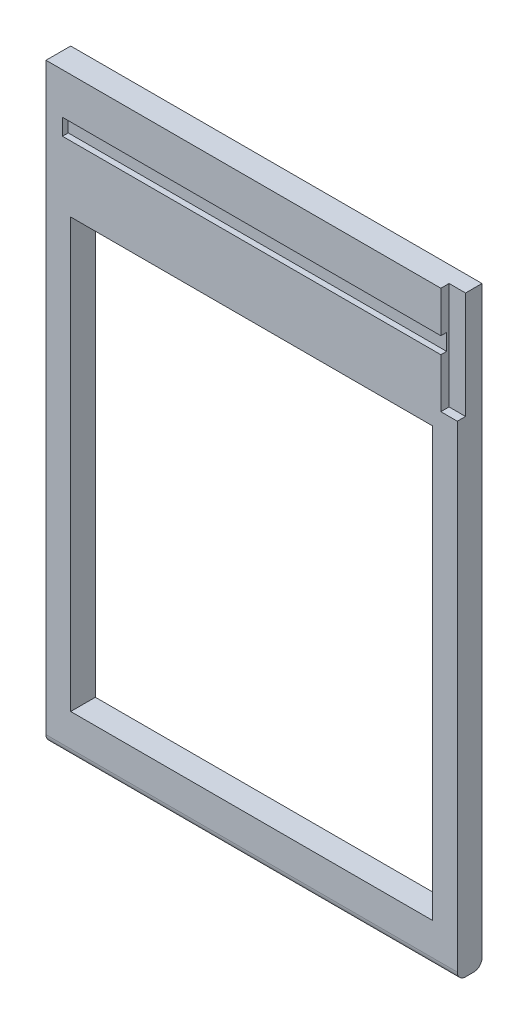
ISO-10303-21;
HEADER;
FILE_DESCRIPTION(('STEP AP214'),'2;1');
FILE_NAME('part.step','',(''),(''),'','','');
FILE_SCHEMA(('AUTOMOTIVE_DESIGN { 1 0 10303 214 1 1 1 1 }'));
ENDSEC;
DATA;
#1=APPLICATION_CONTEXT('core data for automotive mechanical design processes');
#2=APPLICATION_PROTOCOL_DEFINITION('international standard','automotive_design',2000,#1);
#3=PRODUCT_CONTEXT('',#1,'mechanical');
#4=PRODUCT('Part','Part','',(#3));
#5=PRODUCT_RELATED_PRODUCT_CATEGORY('part','',(#4));
#6=PRODUCT_DEFINITION_FORMATION('','',#4);
#7=PRODUCT_DEFINITION_CONTEXT('part definition',#1,'design');
#8=PRODUCT_DEFINITION('design','',#6,#7);
#9=PRODUCT_DEFINITION_SHAPE('','',#8);
#10=(LENGTH_UNIT() NAMED_UNIT(*) SI_UNIT(.MILLI.,.METRE.));
#11=(NAMED_UNIT(*) PLANE_ANGLE_UNIT() SI_UNIT($,.RADIAN.));
#12=(NAMED_UNIT(*) SI_UNIT($,.STERADIAN.) SOLID_ANGLE_UNIT());
#13=UNCERTAINTY_MEASURE_WITH_UNIT(LENGTH_MEASURE(1.E-05),#10,'distance_accuracy_value','');
#14=(GEOMETRIC_REPRESENTATION_CONTEXT(3) GLOBAL_UNCERTAINTY_ASSIGNED_CONTEXT((#13)) GLOBAL_UNIT_ASSIGNED_CONTEXT((#10,
#11,#12)) REPRESENTATION_CONTEXT('',''));
#15=CARTESIAN_POINT('',(0.,0.,0.));
#16=DIRECTION('',(0.,0.,1.));
#17=DIRECTION('',(1.,0.,0.));
#18=AXIS2_PLACEMENT_3D('',#15,#16,#17);
#19=CARTESIAN_POINT('',(0.,0.,30.));
#20=DIRECTION('',(0.,0.,1.));
#21=DIRECTION('',(1.,0.,0.));
#22=AXIS2_PLACEMENT_3D('',#19,#20,#21);
#23=PLANE('',#22);
#24=DIRECTION('',(1.,0.,0.));
#25=VECTOR('',#24,1.);
#26=CARTESIAN_POINT('',(230.,230.,30.));
#27=LINE('',#26,#25);
#28=CARTESIAN_POINT('',(230.,230.,30.));
#29=VERTEX_POINT('',#28);
#30=CARTESIAN_POINT('',(250.,230.,30.));
#31=VERTEX_POINT('',#30);
#32=EDGE_CURVE('E199',#29,#31,#27,.T.);
#33=ORIENTED_EDGE('',*,*,#32,.F.);
#34=DIRECTION('',(0.,-1.,0.));
#35=VECTOR('',#34,1.);
#36=CARTESIAN_POINT('',(230.,230.,30.));
#37=LINE('',#36,#35);
#38=CARTESIAN_POINT('',(230.,290.,30.));
#39=VERTEX_POINT('',#38);
#40=EDGE_CURVE('E181',#39,#29,#37,.T.);
#41=ORIENTED_EDGE('',*,*,#40,.F.);
#42=DIRECTION('',(1.,0.,0.));
#43=VECTOR('',#42,1.);
#44=CARTESIAN_POINT('',(250.,290.,30.));
#45=LINE('',#44,#43);
#46=CARTESIAN_POINT('',(-230.,290.,30.));
#47=VERTEX_POINT('',#46);
#48=EDGE_CURVE('E240',#47,#39,#45,.T.);
#49=ORIENTED_EDGE('',*,*,#48,.F.);
#50=DIRECTION('',(0.,-1.,0.));
#51=VECTOR('',#50,1.);
#52=CARTESIAN_POINT('',(-230.,310.,30.));
#53=LINE('',#52,#51);
#54=CARTESIAN_POINT('',(-230.,310.,30.));
#55=VERTEX_POINT('',#54);
#56=EDGE_CURVE('E61',#55,#47,#53,.T.);
#57=ORIENTED_EDGE('',*,*,#56,.F.);
#58=DIRECTION('',(-1.,0.,0.));
#59=VECTOR('',#58,1.);
#60=CARTESIAN_POINT('',(250.,310.,30.));
#61=LINE('',#60,#59);
#62=CARTESIAN_POINT('',(230.,310.,30.));
#63=VERTEX_POINT('',#62);
#64=EDGE_CURVE('E230',#63,#55,#61,.T.);
#65=ORIENTED_EDGE('',*,*,#64,.F.);
#66=CARTESIAN_POINT('',(230.,360.,30.));
#67=VERTEX_POINT('',#66);
#68=EDGE_CURVE('E193',#67,#63,#37,.T.);
#69=ORIENTED_EDGE('',*,*,#68,.F.);
#70=DIRECTION('',(-1.,0.,0.));
#71=VECTOR('',#70,1.);
#72=CARTESIAN_POINT('',(250.,360.,30.));
#73=LINE('',#72,#71);
#74=CARTESIAN_POINT('',(-250.,360.,30.));
#75=VERTEX_POINT('',#74);
#76=EDGE_CURVE('E346',#67,#75,#73,.T.);
#77=ORIENTED_EDGE('',*,*,#76,.T.);
#78=DIRECTION('',(0.,-1.,0.));
#79=VECTOR('',#78,1.);
#80=CARTESIAN_POINT('',(-250.,-360.,30.));
#81=LINE('',#80,#79);
#82=CARTESIAN_POINT('',(-250.,-350.,30.));
#83=VERTEX_POINT('',#82);
#84=EDGE_CURVE('E339',#75,#83,#81,.T.);
#85=ORIENTED_EDGE('',*,*,#84,.T.);
#86=DIRECTION('',(1.,0.,0.));
#87=VECTOR('',#86,1.);
#88=CARTESIAN_POINT('',(250.,-350.,30.));
#89=LINE('',#88,#87);
#90=CARTESIAN_POINT('',(250.,-350.,30.));
#91=VERTEX_POINT('',#90);
#92=EDGE_CURVE('E385',#83,#91,#89,.T.);
#93=ORIENTED_EDGE('',*,*,#92,.T.);
#94=DIRECTION('',(0.,1.,0.));
#95=VECTOR('',#94,1.);
#96=CARTESIAN_POINT('',(250.,-360.,30.));
#97=LINE('',#96,#95);
#98=EDGE_CURVE('E210',#91,#31,#97,.T.);
#99=ORIENTED_EDGE('',*,*,#98,.T.);
#100=EDGE_LOOP('',(#33,#41,#49,#57,#65,#69,#77,#85,#93,#99));
#101=FACE_BOUND('',#100,.T.);
#102=DIRECTION('',(0.,-1.,0.));
#103=VECTOR('',#102,1.);
#104=CARTESIAN_POINT('',(220.,-310.616152256284,30.));
#105=LINE('',#104,#103);
#106=CARTESIAN_POINT('',(220.,210.,30.));
#107=VERTEX_POINT('',#106);
#108=CARTESIAN_POINT('',(220.,-310.616152256284,30.));
#109=VERTEX_POINT('',#108);
#110=EDGE_CURVE('E295',#107,#109,#105,.T.);
#111=ORIENTED_EDGE('',*,*,#110,.T.);
#112=DIRECTION('',(-1.,0.,0.));
#113=VECTOR('',#112,1.);
#114=CARTESIAN_POINT('',(-220.,-310.616152256284,30.));
#115=LINE('',#114,#113);
#116=CARTESIAN_POINT('',(-220.,-310.616152256284,30.));
#117=VERTEX_POINT('',#116);
#118=EDGE_CURVE('E299',#109,#117,#115,.T.);
#119=ORIENTED_EDGE('',*,*,#118,.T.);
#120=DIRECTION('',(0.,1.,0.));
#121=VECTOR('',#120,1.);
#122=CARTESIAN_POINT('',(-220.,-310.616152256284,30.));
#123=LINE('',#122,#121);
#124=CARTESIAN_POINT('',(-220.,210.,30.));
#125=VERTEX_POINT('',#124);
#126=EDGE_CURVE('E304',#117,#125,#123,.T.);
#127=ORIENTED_EDGE('',*,*,#126,.T.);
#128=DIRECTION('',(1.,0.,0.));
#129=VECTOR('',#128,1.);
#130=CARTESIAN_POINT('',(-220.,210.,30.));
#131=LINE('',#130,#129);
#132=EDGE_CURVE('E308',#125,#107,#131,.T.);
#133=ORIENTED_EDGE('',*,*,#132,.T.);
#134=EDGE_LOOP('',(#111,#119,#127,#133));
#135=FACE_BOUND('',#134,.T.);
#136=ADVANCED_FACE('F38',(#101,#135),#23,.T.);
#137=CARTESIAN_POINT('',(250.,310.,23.));
#138=DIRECTION('',(0.,1.,0.));
#139=DIRECTION('',(-1.,0.,0.));
#140=AXIS2_PLACEMENT_3D('',#137,#138,#139);
#141=PLANE('',#140);
#142=DIRECTION('',(0.,0.,-1.));
#143=VECTOR('',#142,1.);
#144=CARTESIAN_POINT('',(230.,310.,23.));
#145=LINE('',#144,#143);
#146=CARTESIAN_POINT('',(230.,310.,23.));
#147=VERTEX_POINT('',#146);
#148=EDGE_CURVE('E53',#63,#147,#145,.T.);
#149=ORIENTED_EDGE('',*,*,#148,.F.);
#150=ORIENTED_EDGE('',*,*,#64,.T.);
#151=DIRECTION('',(0.,0.,1.));
#152=VECTOR('',#151,1.);
#153=CARTESIAN_POINT('',(-230.,310.,23.));
#154=LINE('',#153,#152);
#155=CARTESIAN_POINT('',(-230.,310.,23.));
#156=VERTEX_POINT('',#155);
#157=EDGE_CURVE('E245',#156,#55,#154,.T.);
#158=ORIENTED_EDGE('',*,*,#157,.F.);
#159=DIRECTION('',(-1.,0.,0.));
#160=VECTOR('',#159,1.);
#161=CARTESIAN_POINT('',(250.,310.,23.));
#162=LINE('',#161,#160);
#163=EDGE_CURVE('E234',#147,#156,#162,.T.);
#164=ORIENTED_EDGE('',*,*,#163,.F.);
#165=EDGE_LOOP('',(#149,#150,#158,#164));
#166=FACE_BOUND('',#165,.T.);
#167=ADVANCED_FACE('F440',(#166),#141,.F.);
#168=CARTESIAN_POINT('',(250.,290.,23.));
#169=DIRECTION('',(0.,-1.,0.));
#170=DIRECTION('',(1.,0.,0.));
#171=AXIS2_PLACEMENT_3D('',#168,#169,#170);
#172=PLANE('',#171);
#173=DIRECTION('',(0.,0.,1.));
#174=VECTOR('',#173,1.);
#175=CARTESIAN_POINT('',(230.,290.,23.));
#176=LINE('',#175,#174);
#177=CARTESIAN_POINT('',(230.,290.,23.));
#178=VERTEX_POINT('',#177);
#179=EDGE_CURVE('E187',#178,#39,#176,.T.);
#180=ORIENTED_EDGE('',*,*,#179,.F.);
#181=DIRECTION('',(1.,0.,0.));
#182=VECTOR('',#181,1.);
#183=CARTESIAN_POINT('',(250.,290.,23.));
#184=LINE('',#183,#182);
#185=CARTESIAN_POINT('',(-230.,290.,23.));
#186=VERTEX_POINT('',#185);
#187=EDGE_CURVE('E229',#186,#178,#184,.T.);
#188=ORIENTED_EDGE('',*,*,#187,.F.);
#189=DIRECTION('',(0.,0.,1.));
#190=VECTOR('',#189,1.);
#191=CARTESIAN_POINT('',(-230.,290.,23.));
#192=LINE('',#191,#190);
#193=EDGE_CURVE('E237',#186,#47,#192,.T.);
#194=ORIENTED_EDGE('',*,*,#193,.T.);
#195=ORIENTED_EDGE('',*,*,#48,.T.);
#196=EDGE_LOOP('',(#180,#188,#194,#195));
#197=FACE_BOUND('',#196,.T.);
#198=ADVANCED_FACE('F443',(#197),#172,.F.);
#199=CARTESIAN_POINT('',(0.,0.,23.));
#200=DIRECTION('',(0.,0.,-1.));
#201=DIRECTION('',(-1.,0.,0.));
#202=AXIS2_PLACEMENT_3D('',#199,#200,#201);
#203=PLANE('',#202);
#204=DIRECTION('',(0.,-1.,0.));
#205=VECTOR('',#204,1.);
#206=CARTESIAN_POINT('',(230.,0.,23.));
#207=LINE('',#206,#205);
#208=EDGE_CURVE('E11',#147,#178,#207,.T.);
#209=ORIENTED_EDGE('',*,*,#208,.F.);
#210=ORIENTED_EDGE('',*,*,#163,.T.);
#211=DIRECTION('',(0.,-1.,0.));
#212=VECTOR('',#211,1.);
#213=CARTESIAN_POINT('',(-230.,310.,23.));
#214=LINE('',#213,#212);
#215=EDGE_CURVE('E225',#156,#186,#214,.T.);
#216=ORIENTED_EDGE('',*,*,#215,.T.);
#217=ORIENTED_EDGE('',*,*,#187,.T.);
#218=EDGE_LOOP('',(#209,#210,#216,#217));
#219=FACE_BOUND('',#218,.T.);
#220=ADVANCED_FACE('F448',(#219),#203,.F.);
#221=CARTESIAN_POINT('',(-250.,-360.,30.));
#222=DIRECTION('',(1.,0.,0.));
#223=DIRECTION('',(0.,0.,-1.));
#224=AXIS2_PLACEMENT_3D('',#221,#222,#223);
#225=PLANE('',#224);
#226=DIRECTION('',(0.,0.,-1.));
#227=VECTOR('',#226,1.);
#228=CARTESIAN_POINT('',(-250.,-360.,30.));
#229=LINE('',#228,#227);
#230=CARTESIAN_POINT('',(-250.,-360.,20.));
#231=VERTEX_POINT('',#230);
#232=CARTESIAN_POINT('',(-250.,-360.,10.));
#233=VERTEX_POINT('',#232);
#234=EDGE_CURVE('E368',#231,#233,#229,.T.);
#235=ORIENTED_EDGE('',*,*,#234,.F.);
#236=CARTESIAN_POINT('',(-250.,-350.,20.));
#237=DIRECTION('',(1.,0.,0.));
#238=DIRECTION('',(0.,0.,-1.));
#239=AXIS2_PLACEMENT_3D('',#236,#237,#238);
#240=CIRCLE('',#239,10.);
#241=EDGE_CURVE('E47',#231,#83,#240,.F.);
#242=ORIENTED_EDGE('',*,*,#241,.T.);
#243=ORIENTED_EDGE('',*,*,#84,.F.);
#244=DIRECTION('',(0.,0.,-1.));
#245=VECTOR('',#244,1.);
#246=CARTESIAN_POINT('',(-250.,360.,30.));
#247=LINE('',#246,#245);
#248=CARTESIAN_POINT('',(-250.,360.,0.));
#249=VERTEX_POINT('',#248);
#250=EDGE_CURVE('E349',#75,#249,#247,.T.);
#251=ORIENTED_EDGE('',*,*,#250,.T.);
#252=DIRECTION('',(0.,-1.,0.));
#253=VECTOR('',#252,1.);
#254=CARTESIAN_POINT('',(-250.,-360.,0.));
#255=LINE('',#254,#253);
#256=CARTESIAN_POINT('',(-250.,-350.,0.));
#257=VERTEX_POINT('',#256);
#258=EDGE_CURVE('E329',#249,#257,#255,.T.);
#259=ORIENTED_EDGE('',*,*,#258,.T.);
#260=CARTESIAN_POINT('',(-250.,-350.,10.));
#261=DIRECTION('',(1.,0.,0.));
#262=DIRECTION('',(0.,0.,-1.));
#263=AXIS2_PLACEMENT_3D('',#260,#261,#262);
#264=CIRCLE('',#263,10.);
#265=EDGE_CURVE('E381',#257,#233,#264,.F.);
#266=ORIENTED_EDGE('',*,*,#265,.T.);
#267=EDGE_LOOP('',(#235,#242,#243,#251,#259,#266));
#268=FACE_BOUND('',#267,.T.);
#269=ADVANCED_FACE('F398',(#268),#225,.F.);
#270=CARTESIAN_POINT('',(250.,-360.,30.));
#271=DIRECTION('',(0.,1.,0.));
#272=DIRECTION('',(-1.,0.,0.));
#273=AXIS2_PLACEMENT_3D('',#270,#271,#272);
#274=PLANE('',#273);
#275=DIRECTION('',(0.,0.,-1.));
#276=VECTOR('',#275,1.);
#277=CARTESIAN_POINT('',(250.,-360.,30.));
#278=LINE('',#277,#276);
#279=CARTESIAN_POINT('',(250.,-360.,20.));
#280=VERTEX_POINT('',#279);
#281=CARTESIAN_POINT('',(250.,-360.,10.));
#282=VERTEX_POINT('',#281);
#283=EDGE_CURVE('E365',#280,#282,#278,.T.);
#284=ORIENTED_EDGE('',*,*,#283,.F.);
#285=DIRECTION('',(1.,0.,0.));
#286=VECTOR('',#285,1.);
#287=CARTESIAN_POINT('',(-250.,-360.,20.));
#288=LINE('',#287,#286);
#289=EDGE_CURVE('E391',#280,#231,#288,.F.);
#290=ORIENTED_EDGE('',*,*,#289,.T.);
#291=ORIENTED_EDGE('',*,*,#234,.T.);
#292=DIRECTION('',(1.,0.,0.));
#293=VECTOR('',#292,1.);
#294=CARTESIAN_POINT('',(250.,-360.,10.));
#295=LINE('',#294,#293);
#296=EDGE_CURVE('E371',#233,#282,#295,.T.);
#297=ORIENTED_EDGE('',*,*,#296,.T.);
#298=EDGE_LOOP('',(#284,#290,#291,#297));
#299=FACE_BOUND('',#298,.T.);
#300=ADVANCED_FACE('F411',(#299),#274,.F.);
#301=CARTESIAN_POINT('',(250.,-360.,30.));
#302=DIRECTION('',(-1.,0.,0.));
#303=DIRECTION('',(0.,0.,1.));
#304=AXIS2_PLACEMENT_3D('',#301,#302,#303);
#305=PLANE('',#304);
#306=DIRECTION('',(0.,0.,-1.));
#307=VECTOR('',#306,1.);
#308=CARTESIAN_POINT('',(250.,360.,30.));
#309=LINE('',#308,#307);
#310=CARTESIAN_POINT('',(250.,360.,20.));
#311=VERTEX_POINT('',#310);
#312=CARTESIAN_POINT('',(250.,360.,0.));
#313=VERTEX_POINT('',#312);
#314=EDGE_CURVE('E362',#311,#313,#309,.T.);
#315=ORIENTED_EDGE('',*,*,#314,.F.);
#316=DIRECTION('',(0.,1.,0.));
#317=VECTOR('',#316,1.);
#318=CARTESIAN_POINT('',(250.,230.,20.));
#319=LINE('',#318,#317);
#320=CARTESIAN_POINT('',(250.,230.,20.));
#321=VERTEX_POINT('',#320);
#322=EDGE_CURVE('E194',#321,#311,#319,.T.);
#323=ORIENTED_EDGE('',*,*,#322,.F.);
#324=DIRECTION('',(0.,0.,-1.));
#325=VECTOR('',#324,1.);
#326=CARTESIAN_POINT('',(250.,230.,20.));
#327=LINE('',#326,#325);
#328=EDGE_CURVE('E427',#31,#321,#327,.T.);
#329=ORIENTED_EDGE('',*,*,#328,.F.);
#330=ORIENTED_EDGE('',*,*,#98,.F.);
#331=CARTESIAN_POINT('',(250.,-350.,20.));
#332=DIRECTION('',(-1.,0.,0.));
#333=DIRECTION('',(0.,0.,1.));
#334=AXIS2_PLACEMENT_3D('',#331,#332,#333);
#335=CIRCLE('',#334,10.);
#336=EDGE_CURVE('E388',#91,#280,#335,.F.);
#337=ORIENTED_EDGE('',*,*,#336,.T.);
#338=ORIENTED_EDGE('',*,*,#283,.T.);
#339=CARTESIAN_POINT('',(250.,-350.,10.));
#340=DIRECTION('',(-1.,0.,0.));
#341=DIRECTION('',(0.,0.,1.));
#342=AXIS2_PLACEMENT_3D('',#339,#340,#341);
#343=CIRCLE('',#342,10.);
#344=CARTESIAN_POINT('',(250.,-350.,0.));
#345=VERTEX_POINT('',#344);
#346=EDGE_CURVE('E375',#282,#345,#343,.F.);
#347=ORIENTED_EDGE('',*,*,#346,.T.);
#348=DIRECTION('',(0.,1.,0.));
#349=VECTOR('',#348,1.);
#350=CARTESIAN_POINT('',(250.,-360.,0.));
#351=LINE('',#350,#349);
#352=EDGE_CURVE('E353',#345,#313,#351,.T.);
#353=ORIENTED_EDGE('',*,*,#352,.T.);
#354=EDGE_LOOP('',(#315,#323,#329,#330,#337,#338,#347,#353));
#355=FACE_BOUND('',#354,.T.);
#356=ADVANCED_FACE('F408',(#355),#305,.F.);
#357=CARTESIAN_POINT('',(250.,360.,30.));
#358=DIRECTION('',(0.,-1.,0.));
#359=DIRECTION('',(1.,0.,0.));
#360=AXIS2_PLACEMENT_3D('',#357,#358,#359);
#361=PLANE('',#360);
#362=DIRECTION('',(0.,0.,1.));
#363=VECTOR('',#362,1.);
#364=CARTESIAN_POINT('',(230.,360.,20.));
#365=LINE('',#364,#363);
#366=CARTESIAN_POINT('',(230.,360.,20.));
#367=VERTEX_POINT('',#366);
#368=EDGE_CURVE('E212',#367,#67,#365,.T.);
#369=ORIENTED_EDGE('',*,*,#368,.F.);
#370=DIRECTION('',(1.,0.,0.));
#371=VECTOR('',#370,1.);
#372=CARTESIAN_POINT('',(230.,360.,20.));
#373=LINE('',#372,#371);
#374=EDGE_CURVE('E216',#367,#311,#373,.T.);
#375=ORIENTED_EDGE('',*,*,#374,.T.);
#376=ORIENTED_EDGE('',*,*,#314,.T.);
#377=DIRECTION('',(-1.,0.,0.));
#378=VECTOR('',#377,1.);
#379=CARTESIAN_POINT('',(250.,360.,0.));
#380=LINE('',#379,#378);
#381=EDGE_CURVE('E343',#313,#249,#380,.T.);
#382=ORIENTED_EDGE('',*,*,#381,.T.);
#383=ORIENTED_EDGE('',*,*,#250,.F.);
#384=ORIENTED_EDGE('',*,*,#76,.F.);
#385=EDGE_LOOP('',(#369,#375,#376,#382,#383,#384));
#386=FACE_BOUND('',#385,.T.);
#387=ADVANCED_FACE('F424',(#386),#361,.F.);
#388=CARTESIAN_POINT('',(0.,0.,0.));
#389=DIRECTION('',(0.,0.,1.));
#390=DIRECTION('',(1.,0.,0.));
#391=AXIS2_PLACEMENT_3D('',#388,#389,#390);
#392=PLANE('',#391);
#393=DIRECTION('',(1.,0.,0.));
#394=VECTOR('',#393,1.);
#395=CARTESIAN_POINT('',(220.,329.028138345803,0.));
#396=LINE('',#395,#394);
#397=CARTESIAN_POINT('',(-220.,329.028138345803,0.));
#398=VERTEX_POINT('',#397);
#399=CARTESIAN_POINT('',(220.,329.028138345803,0.));
#400=VERTEX_POINT('',#399);
#401=EDGE_CURVE('E271',#398,#400,#396,.T.);
#402=ORIENTED_EDGE('',*,*,#401,.F.);
#403=DIRECTION('',(0.,1.,0.));
#404=VECTOR('',#403,1.);
#405=CARTESIAN_POINT('',(-220.,329.028138345803,0.));
#406=LINE('',#405,#404);
#407=CARTESIAN_POINT('',(-220.,239.028138345803,0.));
#408=VERTEX_POINT('',#407);
#409=EDGE_CURVE('E248',#408,#398,#406,.T.);
#410=ORIENTED_EDGE('',*,*,#409,.F.);
#411=DIRECTION('',(-1.,0.,0.));
#412=VECTOR('',#411,1.);
#413=CARTESIAN_POINT('',(220.,239.028138345803,0.));
#414=LINE('',#413,#412);
#415=CARTESIAN_POINT('',(220.,239.028138345803,0.));
#416=VERTEX_POINT('',#415);
#417=EDGE_CURVE('E256',#416,#408,#414,.T.);
#418=ORIENTED_EDGE('',*,*,#417,.F.);
#419=DIRECTION('',(0.,-1.,0.));
#420=VECTOR('',#419,1.);
#421=CARTESIAN_POINT('',(220.,329.028138345803,0.));
#422=LINE('',#421,#420);
#423=EDGE_CURVE('E275',#400,#416,#422,.T.);
#424=ORIENTED_EDGE('',*,*,#423,.F.);
#425=EDGE_LOOP('',(#402,#410,#418,#424));
#426=FACE_BOUND('',#425,.T.);
#427=DIRECTION('',(-1.,0.,0.));
#428=VECTOR('',#427,1.);
#429=CARTESIAN_POINT('',(-220.,-310.616152256284,0.));
#430=LINE('',#429,#428);
#431=CARTESIAN_POINT('',(220.,-310.616152256284,0.));
#432=VERTEX_POINT('',#431);
#433=CARTESIAN_POINT('',(-220.,-310.616152256284,0.));
#434=VERTEX_POINT('',#433);
#435=EDGE_CURVE('E315',#432,#434,#430,.T.);
#436=ORIENTED_EDGE('',*,*,#435,.F.);
#437=DIRECTION('',(0.,-1.,0.));
#438=VECTOR('',#437,1.);
#439=CARTESIAN_POINT('',(220.,-310.616152256284,0.));
#440=LINE('',#439,#438);
#441=CARTESIAN_POINT('',(220.,210.,0.));
#442=VERTEX_POINT('',#441);
#443=EDGE_CURVE('E285',#442,#432,#440,.T.);
#444=ORIENTED_EDGE('',*,*,#443,.F.);
#445=DIRECTION('',(1.,0.,0.));
#446=VECTOR('',#445,1.);
#447=CARTESIAN_POINT('',(-220.,210.,0.));
#448=LINE('',#447,#446);
#449=CARTESIAN_POINT('',(-220.,210.,0.));
#450=VERTEX_POINT('',#449);
#451=EDGE_CURVE('E300',#450,#442,#448,.T.);
#452=ORIENTED_EDGE('',*,*,#451,.F.);
#453=DIRECTION('',(0.,1.,0.));
#454=VECTOR('',#453,1.);
#455=CARTESIAN_POINT('',(-220.,-310.616152256284,0.));
#456=LINE('',#455,#454);
#457=EDGE_CURVE('E319',#434,#450,#456,.T.);
#458=ORIENTED_EDGE('',*,*,#457,.F.);
#459=EDGE_LOOP('',(#436,#444,#452,#458));
#460=FACE_BOUND('',#459,.T.);
#461=ORIENTED_EDGE('',*,*,#352,.F.);
#462=DIRECTION('',(1.,0.,0.));
#463=VECTOR('',#462,1.);
#464=CARTESIAN_POINT('',(0.,-350.,0.));
#465=LINE('',#464,#463);
#466=EDGE_CURVE('E378',#345,#257,#465,.F.);
#467=ORIENTED_EDGE('',*,*,#466,.T.);
#468=ORIENTED_EDGE('',*,*,#258,.F.);
#469=ORIENTED_EDGE('',*,*,#381,.F.);
#470=EDGE_LOOP('',(#461,#467,#468,#469));
#471=FACE_BOUND('',#470,.T.);
#472=ADVANCED_FACE('F420',(#426,#460,#471),#392,.F.);
#473=CARTESIAN_POINT('',(220.,-310.616152256284,30.));
#474=DIRECTION('',(1.,0.,0.));
#475=DIRECTION('',(0.,1.,0.));
#476=AXIS2_PLACEMENT_3D('',#473,#474,#475);
#477=PLANE('',#476);
#478=ORIENTED_EDGE('',*,*,#443,.T.);
#479=DIRECTION('',(0.,0.,-1.));
#480=VECTOR('',#479,1.);
#481=CARTESIAN_POINT('',(220.,-310.616152256284,30.));
#482=LINE('',#481,#480);
#483=EDGE_CURVE('E312',#109,#432,#482,.T.);
#484=ORIENTED_EDGE('',*,*,#483,.F.);
#485=ORIENTED_EDGE('',*,*,#110,.F.);
#486=DIRECTION('',(0.,0.,-1.));
#487=VECTOR('',#486,1.);
#488=CARTESIAN_POINT('',(220.,210.,30.));
#489=LINE('',#488,#487);
#490=EDGE_CURVE('E326',#107,#442,#489,.T.);
#491=ORIENTED_EDGE('',*,*,#490,.T.);
#492=EDGE_LOOP('',(#478,#484,#485,#491));
#493=FACE_BOUND('',#492,.T.);
#494=ADVANCED_FACE('F468',(#493),#477,.F.);
#495=CARTESIAN_POINT('',(-220.,210.,30.));
#496=DIRECTION('',(0.,1.,0.));
#497=DIRECTION('',(-1.,0.,0.));
#498=AXIS2_PLACEMENT_3D('',#495,#496,#497);
#499=PLANE('',#498);
#500=ORIENTED_EDGE('',*,*,#451,.T.);
#501=ORIENTED_EDGE('',*,*,#490,.F.);
#502=ORIENTED_EDGE('',*,*,#132,.F.);
#503=DIRECTION('',(0.,0.,-1.));
#504=VECTOR('',#503,1.);
#505=CARTESIAN_POINT('',(-220.,210.,30.));
#506=LINE('',#505,#504);
#507=EDGE_CURVE('E330',#125,#450,#506,.T.);
#508=ORIENTED_EDGE('',*,*,#507,.T.);
#509=EDGE_LOOP('',(#500,#501,#502,#508));
#510=FACE_BOUND('',#509,.T.);
#511=ADVANCED_FACE('F489',(#510),#499,.F.);
#512=CARTESIAN_POINT('',(-220.,-310.616152256284,30.));
#513=DIRECTION('',(-1.,0.,0.));
#514=DIRECTION('',(0.,0.,1.));
#515=AXIS2_PLACEMENT_3D('',#512,#513,#514);
#516=PLANE('',#515);
#517=ORIENTED_EDGE('',*,*,#457,.T.);
#518=ORIENTED_EDGE('',*,*,#507,.F.);
#519=ORIENTED_EDGE('',*,*,#126,.F.);
#520=DIRECTION('',(0.,0.,-1.));
#521=VECTOR('',#520,1.);
#522=CARTESIAN_POINT('',(-220.,-310.616152256284,30.));
#523=LINE('',#522,#521);
#524=EDGE_CURVE('E333',#117,#434,#523,.T.);
#525=ORIENTED_EDGE('',*,*,#524,.T.);
#526=EDGE_LOOP('',(#517,#518,#519,#525));
#527=FACE_BOUND('',#526,.T.);
#528=ADVANCED_FACE('F484',(#527),#516,.F.);
#529=CARTESIAN_POINT('',(-220.,-310.616152256284,30.));
#530=DIRECTION('',(0.,-1.,0.));
#531=DIRECTION('',(1.,0.,0.));
#532=AXIS2_PLACEMENT_3D('',#529,#530,#531);
#533=PLANE('',#532);
#534=ORIENTED_EDGE('',*,*,#435,.T.);
#535=ORIENTED_EDGE('',*,*,#524,.F.);
#536=ORIENTED_EDGE('',*,*,#118,.F.);
#537=ORIENTED_EDGE('',*,*,#483,.T.);
#538=EDGE_LOOP('',(#534,#535,#536,#537));
#539=FACE_BOUND('',#538,.T.);
#540=ADVANCED_FACE('F478',(#539),#533,.F.);
#541=CARTESIAN_POINT('',(250.,-350.,10.));
#542=DIRECTION('',(1.,0.,0.));
#543=DIRECTION('',(0.,1.,0.));
#544=AXIS2_PLACEMENT_3D('',#541,#542,#543);
#545=CYLINDRICAL_SURFACE('',#544,10.);
#546=ORIENTED_EDGE('',*,*,#265,.F.);
#547=ORIENTED_EDGE('',*,*,#466,.F.);
#548=ORIENTED_EDGE('',*,*,#346,.F.);
#549=ORIENTED_EDGE('',*,*,#296,.F.);
#550=EDGE_LOOP('',(#546,#547,#548,#549));
#551=FACE_BOUND('',#550,.T.);
#552=ADVANCED_FACE('F415',(#551),#545,.T.);
#553=CARTESIAN_POINT('',(0.,-350.,20.));
#554=DIRECTION('',(-1.,0.,0.));
#555=DIRECTION('',(0.,-1.,0.));
#556=AXIS2_PLACEMENT_3D('',#553,#554,#555);
#557=CYLINDRICAL_SURFACE('',#556,10.);
#558=ORIENTED_EDGE('',*,*,#241,.F.);
#559=ORIENTED_EDGE('',*,*,#289,.F.);
#560=ORIENTED_EDGE('',*,*,#336,.F.);
#561=ORIENTED_EDGE('',*,*,#92,.F.);
#562=EDGE_LOOP('',(#558,#559,#560,#561));
#563=FACE_BOUND('',#562,.T.);
#564=ADVANCED_FACE('F40',(#563),#557,.T.);
#565=CARTESIAN_POINT('',(-220.,329.028138345803,5.));
#566=DIRECTION('',(-1.,0.,0.));
#567=DIRECTION('',(0.,0.,1.));
#568=AXIS2_PLACEMENT_3D('',#565,#566,#567);
#569=PLANE('',#568);
#570=ORIENTED_EDGE('',*,*,#409,.T.);
#571=DIRECTION('',(0.,0.,-1.));
#572=VECTOR('',#571,1.);
#573=CARTESIAN_POINT('',(-220.,329.028138345803,5.));
#574=LINE('',#573,#572);
#575=CARTESIAN_POINT('',(-220.,329.028138345803,5.));
#576=VERTEX_POINT('',#575);
#577=EDGE_CURVE('E268',#576,#398,#574,.T.);
#578=ORIENTED_EDGE('',*,*,#577,.F.);
#579=DIRECTION('',(0.,1.,0.));
#580=VECTOR('',#579,1.);
#581=CARTESIAN_POINT('',(-220.,329.028138345803,5.));
#582=LINE('',#581,#580);
#583=CARTESIAN_POINT('',(-220.,239.028138345803,5.));
#584=VERTEX_POINT('',#583);
#585=EDGE_CURVE('E251',#584,#576,#582,.T.);
#586=ORIENTED_EDGE('',*,*,#585,.F.);
#587=DIRECTION('',(0.,0.,-1.));
#588=VECTOR('',#587,1.);
#589=CARTESIAN_POINT('',(-220.,239.028138345803,5.));
#590=LINE('',#589,#588);
#591=EDGE_CURVE('E282',#584,#408,#590,.T.);
#592=ORIENTED_EDGE('',*,*,#591,.T.);
#593=EDGE_LOOP('',(#570,#578,#586,#592));
#594=FACE_BOUND('',#593,.T.);
#595=ADVANCED_FACE('F483',(#594),#569,.F.);
#596=CARTESIAN_POINT('',(220.,239.028138345803,5.));
#597=DIRECTION('',(0.,-1.,0.));
#598=DIRECTION('',(0.,0.,-1.));
#599=AXIS2_PLACEMENT_3D('',#596,#597,#598);
#600=PLANE('',#599);
#601=ORIENTED_EDGE('',*,*,#417,.T.);
#602=ORIENTED_EDGE('',*,*,#591,.F.);
#603=DIRECTION('',(-1.,0.,0.));
#604=VECTOR('',#603,1.);
#605=CARTESIAN_POINT('',(220.,239.028138345803,5.));
#606=LINE('',#605,#604);
#607=CARTESIAN_POINT('',(220.,239.028138345803,5.));
#608=VERTEX_POINT('',#607);
#609=EDGE_CURVE('E264',#608,#584,#606,.T.);
#610=ORIENTED_EDGE('',*,*,#609,.F.);
#611=DIRECTION('',(0.,0.,-1.));
#612=VECTOR('',#611,1.);
#613=CARTESIAN_POINT('',(220.,239.028138345803,5.));
#614=LINE('',#613,#612);
#615=EDGE_CURVE('E286',#608,#416,#614,.T.);
#616=ORIENTED_EDGE('',*,*,#615,.T.);
#617=EDGE_LOOP('',(#601,#602,#610,#616));
#618=FACE_BOUND('',#617,.T.);
#619=ADVANCED_FACE('F498',(#618),#600,.F.);
#620=CARTESIAN_POINT('',(220.,329.028138345803,5.));
#621=DIRECTION('',(1.,0.,0.));
#622=DIRECTION('',(0.,0.,-1.));
#623=AXIS2_PLACEMENT_3D('',#620,#621,#622);
#624=PLANE('',#623);
#625=ORIENTED_EDGE('',*,*,#423,.T.);
#626=ORIENTED_EDGE('',*,*,#615,.F.);
#627=DIRECTION('',(0.,-1.,0.));
#628=VECTOR('',#627,1.);
#629=CARTESIAN_POINT('',(220.,329.028138345803,5.));
#630=LINE('',#629,#628);
#631=CARTESIAN_POINT('',(220.,329.028138345803,5.));
#632=VERTEX_POINT('',#631);
#633=EDGE_CURVE('E260',#632,#608,#630,.T.);
#634=ORIENTED_EDGE('',*,*,#633,.F.);
#635=DIRECTION('',(0.,0.,-1.));
#636=VECTOR('',#635,1.);
#637=CARTESIAN_POINT('',(220.,329.028138345803,5.));
#638=LINE('',#637,#636);
#639=EDGE_CURVE('E289',#632,#400,#638,.T.);
#640=ORIENTED_EDGE('',*,*,#639,.T.);
#641=EDGE_LOOP('',(#625,#626,#634,#640));
#642=FACE_BOUND('',#641,.T.);
#643=ADVANCED_FACE('F504',(#642),#624,.F.);
#644=CARTESIAN_POINT('',(220.,329.028138345803,5.));
#645=DIRECTION('',(0.,1.,0.));
#646=DIRECTION('',(0.,0.,1.));
#647=AXIS2_PLACEMENT_3D('',#644,#645,#646);
#648=PLANE('',#647);
#649=ORIENTED_EDGE('',*,*,#401,.T.);
#650=ORIENTED_EDGE('',*,*,#639,.F.);
#651=DIRECTION('',(1.,0.,0.));
#652=VECTOR('',#651,1.);
#653=CARTESIAN_POINT('',(220.,329.028138345803,5.));
#654=LINE('',#653,#652);
#655=EDGE_CURVE('E255',#576,#632,#654,.T.);
#656=ORIENTED_EDGE('',*,*,#655,.F.);
#657=ORIENTED_EDGE('',*,*,#577,.T.);
#658=EDGE_LOOP('',(#649,#650,#656,#657));
#659=FACE_BOUND('',#658,.T.);
#660=ADVANCED_FACE('F500',(#659),#648,.F.);
#661=CARTESIAN_POINT('',(0.,0.,5.));
#662=DIRECTION('',(0.,0.,-1.));
#663=DIRECTION('',(-1.,0.,0.));
#664=AXIS2_PLACEMENT_3D('',#661,#662,#663);
#665=PLANE('',#664);
#666=ORIENTED_EDGE('',*,*,#585,.T.);
#667=ORIENTED_EDGE('',*,*,#655,.T.);
#668=ORIENTED_EDGE('',*,*,#633,.T.);
#669=ORIENTED_EDGE('',*,*,#609,.T.);
#670=EDGE_LOOP('',(#666,#667,#668,#669));
#671=FACE_BOUND('',#670,.T.);
#672=ADVANCED_FACE('F503',(#671),#665,.T.);
#673=CARTESIAN_POINT('',(-230.,310.,23.));
#674=DIRECTION('',(-1.,0.,0.));
#675=DIRECTION('',(0.,0.,1.));
#676=AXIS2_PLACEMENT_3D('',#673,#674,#675);
#677=PLANE('',#676);
#678=ORIENTED_EDGE('',*,*,#56,.T.);
#679=ORIENTED_EDGE('',*,*,#193,.F.);
#680=ORIENTED_EDGE('',*,*,#215,.F.);
#681=ORIENTED_EDGE('',*,*,#157,.T.);
#682=EDGE_LOOP('',(#678,#679,#680,#681));
#683=FACE_BOUND('',#682,.T.);
#684=ADVANCED_FACE('F446',(#683),#677,.F.);
#685=CARTESIAN_POINT('',(230.,0.,0.));
#686=DIRECTION('',(1.,0.,0.));
#687=DIRECTION('',(0.,0.,-1.));
#688=AXIS2_PLACEMENT_3D('',#685,#686,#687);
#689=PLANE('',#688);
#690=ORIENTED_EDGE('',*,*,#148,.T.);
#691=ORIENTED_EDGE('',*,*,#208,.T.);
#692=ORIENTED_EDGE('',*,*,#179,.T.);
#693=ORIENTED_EDGE('',*,*,#40,.T.);
#694=DIRECTION('',(0.,0.,-1.));
#695=VECTOR('',#694,1.);
#696=CARTESIAN_POINT('',(230.,230.,20.));
#697=LINE('',#696,#695);
#698=CARTESIAN_POINT('',(230.,230.,20.));
#699=VERTEX_POINT('',#698);
#700=EDGE_CURVE('E185',#29,#699,#697,.T.);
#701=ORIENTED_EDGE('',*,*,#700,.T.);
#702=DIRECTION('',(0.,1.,0.));
#703=VECTOR('',#702,1.);
#704=CARTESIAN_POINT('',(230.,230.,20.));
#705=LINE('',#704,#703);
#706=EDGE_CURVE('E204',#699,#367,#705,.T.);
#707=ORIENTED_EDGE('',*,*,#706,.T.);
#708=ORIENTED_EDGE('',*,*,#368,.T.);
#709=ORIENTED_EDGE('',*,*,#68,.T.);
#710=EDGE_LOOP('',(#690,#691,#692,#693,#701,#707,#708,#709));
#711=FACE_BOUND('',#710,.T.);
#712=ADVANCED_FACE('F183',(#711),#689,.T.);
#713=CARTESIAN_POINT('',(230.,230.,20.));
#714=DIRECTION('',(0.,0.,-1.));
#715=DIRECTION('',(-1.,0.,0.));
#716=AXIS2_PLACEMENT_3D('',#713,#714,#715);
#717=PLANE('',#716);
#718=ORIENTED_EDGE('',*,*,#322,.T.);
#719=ORIENTED_EDGE('',*,*,#374,.F.);
#720=ORIENTED_EDGE('',*,*,#706,.F.);
#721=DIRECTION('',(1.,0.,0.));
#722=VECTOR('',#721,1.);
#723=CARTESIAN_POINT('',(230.,230.,20.));
#724=LINE('',#723,#722);
#725=EDGE_CURVE('E201',#699,#321,#724,.T.);
#726=ORIENTED_EDGE('',*,*,#725,.T.);
#727=EDGE_LOOP('',(#718,#719,#720,#726));
#728=FACE_BOUND('',#727,.T.);
#729=ADVANCED_FACE('F519',(#728),#717,.F.);
#730=CARTESIAN_POINT('',(230.,230.,20.));
#731=DIRECTION('',(0.,-1.,0.));
#732=DIRECTION('',(0.,0.,-1.));
#733=AXIS2_PLACEMENT_3D('',#730,#731,#732);
#734=PLANE('',#733);
#735=ORIENTED_EDGE('',*,*,#328,.T.);
#736=ORIENTED_EDGE('',*,*,#725,.F.);
#737=ORIENTED_EDGE('',*,*,#700,.F.);
#738=ORIENTED_EDGE('',*,*,#32,.T.);
#739=EDGE_LOOP('',(#735,#736,#737,#738));
#740=FACE_BOUND('',#739,.T.);
#741=ADVANCED_FACE('F198',(#740),#734,.F.);
#742=CLOSED_SHELL('',(#136,#167,#198,#220,#269,#300,#356,#387,#472,#494,#511,#528,#540,#552,
#564,#595,#619,#643,#660,#672,#684,#712,#729,#741));
#743=MANIFOLD_SOLID_BREP('B2',#742);
#744=ADVANCED_BREP_SHAPE_REPRESENTATION('',(#18,#743),#14);
#745=SHAPE_DEFINITION_REPRESENTATION(#9,#744);
ENDSEC;
END-ISO-10303-21;
